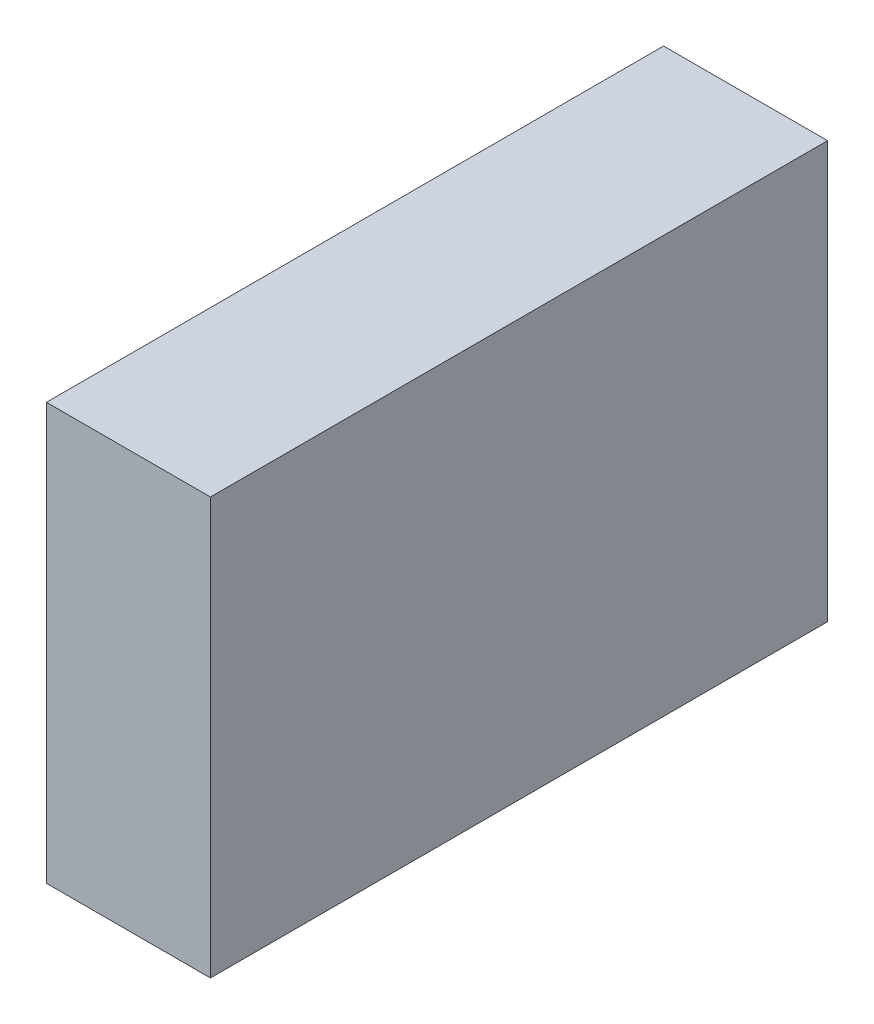
ISO-10303-21;
HEADER;
FILE_DESCRIPTION(('STEP AP214'),'2;1');
FILE_NAME('part.step','',(''),(''),'','','');
FILE_SCHEMA(('AUTOMOTIVE_DESIGN { 1 0 10303 214 1 1 1 1 }'));
ENDSEC;
DATA;
#1=APPLICATION_CONTEXT('core data for automotive mechanical design processes');
#2=APPLICATION_PROTOCOL_DEFINITION('international standard','automotive_design',2000,#1);
#3=PRODUCT_CONTEXT('',#1,'mechanical');
#4=PRODUCT('Part','Part','',(#3));
#5=PRODUCT_RELATED_PRODUCT_CATEGORY('part','',(#4));
#6=PRODUCT_DEFINITION_FORMATION('','',#4);
#7=PRODUCT_DEFINITION_CONTEXT('part definition',#1,'design');
#8=PRODUCT_DEFINITION('design','',#6,#7);
#9=PRODUCT_DEFINITION_SHAPE('','',#8);
#10=(LENGTH_UNIT() NAMED_UNIT(*) SI_UNIT(.MILLI.,.METRE.));
#11=(NAMED_UNIT(*) PLANE_ANGLE_UNIT() SI_UNIT($,.RADIAN.));
#12=(NAMED_UNIT(*) SI_UNIT($,.STERADIAN.) SOLID_ANGLE_UNIT());
#13=UNCERTAINTY_MEASURE_WITH_UNIT(LENGTH_MEASURE(1.E-05),#10,'distance_accuracy_value','');
#14=(GEOMETRIC_REPRESENTATION_CONTEXT(3) GLOBAL_UNCERTAINTY_ASSIGNED_CONTEXT((#13)) GLOBAL_UNIT_ASSIGNED_CONTEXT((#10,
#11,#12)) REPRESENTATION_CONTEXT('',''));
#15=CARTESIAN_POINT('',(0.,0.,0.));
#16=DIRECTION('',(0.,0.,1.));
#17=DIRECTION('',(1.,0.,0.));
#18=AXIS2_PLACEMENT_3D('',#15,#16,#17);
#19=CARTESIAN_POINT('',(27.15000110023,-1.7234488966881,-2.54084408189482));
#20=DIRECTION('',(1.,0.,0.));
#21=DIRECTION('',(0.,0.,-1.));
#22=AXIS2_PLACEMENT_3D('',#19,#20,#21);
#23=PLANE('',#22);
#24=DIRECTION('',(0.,-1.,0.));
#25=VECTOR('',#24,1.);
#26=CARTESIAN_POINT('',(27.15000110023,-1.7234488966881,2.53915591810518));
#27=LINE('',#26,#25);
#28=CARTESIAN_POINT('',(27.15000110023,1.7055511031969,2.53915591810518));
#29=VERTEX_POINT('',#28);
#30=CARTESIAN_POINT('',(27.15000110023,-1.7234488966881,2.53915591812268));
#31=VERTEX_POINT('',#30);
#32=EDGE_CURVE('E107',#29,#31,#27,.T.);
#33=ORIENTED_EDGE('',*,*,#32,.F.);
#34=DIRECTION('',(0.,0.,1.));
#35=VECTOR('',#34,1.);
#36=CARTESIAN_POINT('',(27.15000110023,1.7055511033119,2.53915591810518));
#37=LINE('',#36,#35);
#38=CARTESIAN_POINT('',(27.15000110023,1.7055511033119,-2.54084408191482));
#39=VERTEX_POINT('',#38);
#40=EDGE_CURVE('E27',#39,#29,#37,.T.);
#41=ORIENTED_EDGE('',*,*,#40,.F.);
#42=DIRECTION('',(0.,1.,0.));
#43=VECTOR('',#42,1.);
#44=CARTESIAN_POINT('',(27.15000110023,1.7055511033119,-2.54084408189482));
#45=LINE('',#44,#43);
#46=CARTESIAN_POINT('',(27.15000110023,-1.7234488966881,-2.54084408189482));
#47=VERTEX_POINT('',#46);
#48=EDGE_CURVE('E11',#47,#39,#45,.T.);
#49=ORIENTED_EDGE('',*,*,#48,.F.);
#50=DIRECTION('',(0.,0.,-1.));
#51=VECTOR('',#50,1.);
#52=CARTESIAN_POINT('',(27.15000110023,-1.7234488966881,-2.54084408189482));
#53=LINE('',#52,#51);
#54=EDGE_CURVE('E20',#31,#47,#53,.T.);
#55=ORIENTED_EDGE('',*,*,#54,.F.);
#56=EDGE_LOOP('',(#33,#41,#49,#55));
#57=FACE_BOUND('',#56,.T.);
#58=ADVANCED_FACE('F16',(#57),#23,.F.);
#59=CARTESIAN_POINT('',(27.15000110023,1.7055511033119,-2.54084408189482));
#60=DIRECTION('',(0.,0.,-1.));
#61=DIRECTION('',(-1.,0.,0.));
#62=AXIS2_PLACEMENT_3D('',#59,#60,#61);
#63=PLANE('',#62);
#64=DIRECTION('',(1.,0.,0.));
#65=VECTOR('',#64,1.);
#66=CARTESIAN_POINT('',(27.15000110023,-1.7234488966881,-2.54084408189482));
#67=LINE('',#66,#65);
#68=CARTESIAN_POINT('',(28.50000093981,-1.7234488966881,-2.54084408189482));
#69=VERTEX_POINT('',#68);
#70=EDGE_CURVE('E73',#47,#69,#67,.T.);
#71=ORIENTED_EDGE('',*,*,#70,.F.);
#72=ORIENTED_EDGE('',*,*,#48,.T.);
#73=DIRECTION('',(-1.,0.,0.));
#74=VECTOR('',#73,1.);
#75=CARTESIAN_POINT('',(27.15000110023,1.7055511033119,-2.54084408197482));
#76=LINE('',#75,#74);
#77=CARTESIAN_POINT('',(28.50000093981,1.7055511033119,-2.54084408191482));
#78=VERTEX_POINT('',#77);
#79=EDGE_CURVE('E86',#78,#39,#76,.T.);
#80=ORIENTED_EDGE('',*,*,#79,.F.);
#81=DIRECTION('',(0.,1.,0.));
#82=VECTOR('',#81,1.);
#83=CARTESIAN_POINT('',(28.50000094023,-1.7234488966881,-2.54084408189482));
#84=LINE('',#83,#82);
#85=EDGE_CURVE('E84',#69,#78,#84,.T.);
#86=ORIENTED_EDGE('',*,*,#85,.F.);
#87=EDGE_LOOP('',(#71,#72,#80,#86));
#88=FACE_BOUND('',#87,.T.);
#89=ADVANCED_FACE('F18',(#88),#63,.T.);
#90=CARTESIAN_POINT('',(27.15000110023,1.7055511033119,2.53915591810518));
#91=DIRECTION('',(0.,1.,0.));
#92=DIRECTION('',(0.,0.,-1.));
#93=AXIS2_PLACEMENT_3D('',#90,#91,#92);
#94=PLANE('',#93);
#95=ORIENTED_EDGE('',*,*,#79,.T.);
#96=ORIENTED_EDGE('',*,*,#40,.T.);
#97=DIRECTION('',(-1.,0.,0.));
#98=VECTOR('',#97,1.);
#99=CARTESIAN_POINT('',(27.15000110023,1.7055511028519,2.53915591810518));
#100=LINE('',#99,#98);
#101=CARTESIAN_POINT('',(28.50000093981,1.7055511031969,2.53915591810518));
#102=VERTEX_POINT('',#101);
#103=EDGE_CURVE('E81',#102,#29,#100,.T.);
#104=ORIENTED_EDGE('',*,*,#103,.F.);
#105=DIRECTION('',(0.,0.,1.));
#106=VECTOR('',#105,1.);
#107=CARTESIAN_POINT('',(28.50000094023,1.7055511033119,-2.54084408189482));
#108=LINE('',#107,#106);
#109=EDGE_CURVE('E91',#78,#102,#108,.T.);
#110=ORIENTED_EDGE('',*,*,#109,.F.);
#111=EDGE_LOOP('',(#95,#96,#104,#110));
#112=FACE_BOUND('',#111,.T.);
#113=ADVANCED_FACE('F161',(#112),#94,.T.);
#114=CARTESIAN_POINT('',(27.15000110023,-1.7234488966881,2.53915591810518));
#115=DIRECTION('',(0.,0.,1.));
#116=DIRECTION('',(0.,-1.,0.));
#117=AXIS2_PLACEMENT_3D('',#114,#115,#116);
#118=PLANE('',#117);
#119=ORIENTED_EDGE('',*,*,#103,.T.);
#120=ORIENTED_EDGE('',*,*,#32,.T.);
#121=DIRECTION('',(-1.,0.,0.));
#122=VECTOR('',#121,1.);
#123=CARTESIAN_POINT('',(27.15000110023,-1.7234488966881,2.53915591817518));
#124=LINE('',#123,#122);
#125=CARTESIAN_POINT('',(28.50000093981,-1.7234488966881,2.53915591812268));
#126=VERTEX_POINT('',#125);
#127=EDGE_CURVE('E65',#126,#31,#124,.T.);
#128=ORIENTED_EDGE('',*,*,#127,.F.);
#129=DIRECTION('',(0.,-1.,0.));
#130=VECTOR('',#129,1.);
#131=CARTESIAN_POINT('',(28.50000094023,-1.7234488966881,2.53915591810518));
#132=LINE('',#131,#130);
#133=EDGE_CURVE('E94',#102,#126,#132,.T.);
#134=ORIENTED_EDGE('',*,*,#133,.F.);
#135=EDGE_LOOP('',(#119,#120,#128,#134));
#136=FACE_BOUND('',#135,.T.);
#137=ADVANCED_FACE('F121',(#136),#118,.T.);
#138=CARTESIAN_POINT('',(27.15000110023,-1.7234488966881,-2.54084408189482));
#139=DIRECTION('',(0.,-1.,0.));
#140=DIRECTION('',(0.,0.,-1.));
#141=AXIS2_PLACEMENT_3D('',#138,#139,#140);
#142=PLANE('',#141);
#143=ORIENTED_EDGE('',*,*,#127,.T.);
#144=ORIENTED_EDGE('',*,*,#54,.T.);
#145=ORIENTED_EDGE('',*,*,#70,.T.);
#146=DIRECTION('',(0.,0.,-1.));
#147=VECTOR('',#146,1.);
#148=CARTESIAN_POINT('',(28.50000094023,-1.7234488966881,-2.54084408189482));
#149=LINE('',#148,#147);
#150=EDGE_CURVE('E77',#126,#69,#149,.T.);
#151=ORIENTED_EDGE('',*,*,#150,.F.);
#152=EDGE_LOOP('',(#143,#144,#145,#151));
#153=FACE_BOUND('',#152,.T.);
#154=ADVANCED_FACE('F75',(#153),#142,.T.);
#155=CARTESIAN_POINT('',(28.50000094023,-1.7234488966881,-2.54084408189482));
#156=DIRECTION('',(1.,0.,0.));
#157=DIRECTION('',(0.,0.,-1.));
#158=AXIS2_PLACEMENT_3D('',#155,#156,#157);
#159=PLANE('',#158);
#160=ORIENTED_EDGE('',*,*,#133,.T.);
#161=ORIENTED_EDGE('',*,*,#150,.T.);
#162=ORIENTED_EDGE('',*,*,#85,.T.);
#163=ORIENTED_EDGE('',*,*,#109,.T.);
#164=EDGE_LOOP('',(#160,#161,#162,#163));
#165=FACE_BOUND('',#164,.T.);
#166=ADVANCED_FACE('F93',(#165),#159,.T.);
#167=CLOSED_SHELL('',(#58,#89,#113,#137,#154,#166));
#168=MANIFOLD_SOLID_BREP('B1',#167);
#169=ADVANCED_BREP_SHAPE_REPRESENTATION('',(#18,#168),#14);
#170=SHAPE_DEFINITION_REPRESENTATION(#9,#169);
ENDSEC;
END-ISO-10303-21;
